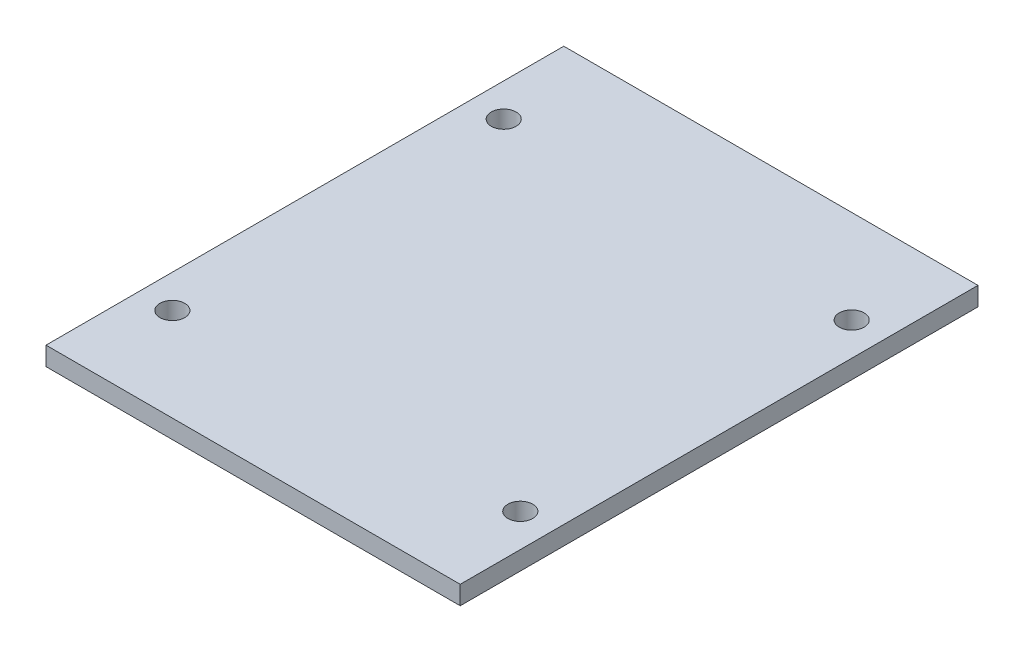
ISO-10303-21;
HEADER;
FILE_DESCRIPTION(('STEP AP214'),'2;1');
FILE_NAME('part.step','',(''),(''),'','','');
FILE_SCHEMA(('AUTOMOTIVE_DESIGN { 1 0 10303 214 1 1 1 1 }'));
ENDSEC;
DATA;
#1=APPLICATION_CONTEXT('core data for automotive mechanical design processes');
#2=APPLICATION_PROTOCOL_DEFINITION('international standard','automotive_design',2000,#1);
#3=PRODUCT_CONTEXT('',#1,'mechanical');
#4=PRODUCT('Part','Part','',(#3));
#5=PRODUCT_RELATED_PRODUCT_CATEGORY('part','',(#4));
#6=PRODUCT_DEFINITION_FORMATION('','',#4);
#7=PRODUCT_DEFINITION_CONTEXT('part definition',#1,'design');
#8=PRODUCT_DEFINITION('design','',#6,#7);
#9=PRODUCT_DEFINITION_SHAPE('','',#8);
#10=(LENGTH_UNIT() NAMED_UNIT(*) SI_UNIT(.MILLI.,.METRE.));
#11=(NAMED_UNIT(*) PLANE_ANGLE_UNIT() SI_UNIT($,.RADIAN.));
#12=(NAMED_UNIT(*) SI_UNIT($,.STERADIAN.) SOLID_ANGLE_UNIT());
#13=UNCERTAINTY_MEASURE_WITH_UNIT(LENGTH_MEASURE(1.E-05),#10,'distance_accuracy_value','');
#14=(GEOMETRIC_REPRESENTATION_CONTEXT(3) GLOBAL_UNCERTAINTY_ASSIGNED_CONTEXT((#13)) GLOBAL_UNIT_ASSIGNED_CONTEXT((#10,
#11,#12)) REPRESENTATION_CONTEXT('',''));
#15=CARTESIAN_POINT('',(0.,0.,0.));
#16=DIRECTION('',(0.,0.,1.));
#17=DIRECTION('',(1.,0.,0.));
#18=AXIS2_PLACEMENT_3D('',#15,#16,#17);
#19=CARTESIAN_POINT('',(0.,0.,250.));
#20=DIRECTION('',(1.,0.,0.));
#21=DIRECTION('',(0.,0.,-1.));
#22=AXIS2_PLACEMENT_3D('',#19,#20,#21);
#23=PLANE('',#22);
#24=DIRECTION('',(0.,-1.,0.));
#25=VECTOR('',#24,1.);
#26=CARTESIAN_POINT('',(0.,0.,0.));
#27=LINE('',#26,#25);
#28=CARTESIAN_POINT('',(0.,0.,0.));
#29=VERTEX_POINT('',#28);
#30=CARTESIAN_POINT('',(0.,-9.,0.));
#31=VERTEX_POINT('',#30);
#32=EDGE_CURVE('E107',#29,#31,#27,.T.);
#33=ORIENTED_EDGE('',*,*,#32,.T.);
#34=DIRECTION('',(0.,0.,-1.));
#35=VECTOR('',#34,1.);
#36=CARTESIAN_POINT('',(0.,-9.,250.));
#37=LINE('',#36,#35);
#38=CARTESIAN_POINT('',(0.,-9.,250.));
#39=VERTEX_POINT('',#38);
#40=EDGE_CURVE('E11',#39,#31,#37,.T.);
#41=ORIENTED_EDGE('',*,*,#40,.F.);
#42=DIRECTION('',(0.,-1.,0.));
#43=VECTOR('',#42,1.);
#44=CARTESIAN_POINT('',(0.,0.,250.));
#45=LINE('',#44,#43);
#46=CARTESIAN_POINT('',(0.,0.,250.));
#47=VERTEX_POINT('',#46);
#48=EDGE_CURVE('E89',#47,#39,#45,.T.);
#49=ORIENTED_EDGE('',*,*,#48,.F.);
#50=DIRECTION('',(0.,0.,-1.));
#51=VECTOR('',#50,1.);
#52=CARTESIAN_POINT('',(0.,0.,250.));
#53=LINE('',#52,#51);
#54=EDGE_CURVE('E56',#47,#29,#53,.T.);
#55=ORIENTED_EDGE('',*,*,#54,.T.);
#56=EDGE_LOOP('',(#33,#41,#49,#55));
#57=FACE_BOUND('',#56,.T.);
#58=ADVANCED_FACE('F39',(#57),#23,.F.);
#59=CARTESIAN_POINT('',(0.,-9.,250.));
#60=DIRECTION('',(0.,1.,0.));
#61=DIRECTION('',(0.,0.,1.));
#62=AXIS2_PLACEMENT_3D('',#59,#60,#61);
#63=PLANE('',#62);
#64=CARTESIAN_POINT('',(184.,-9.,45.));
#65=DIRECTION('',(0.,1.,0.));
#66=DIRECTION('',(0.,0.,1.));
#67=AXIS2_PLACEMENT_3D('',#64,#65,#66);
#68=CIRCLE('',#67,6.00000000000002);
#69=CARTESIAN_POINT('',(184.,-9.,51.));
#70=VERTEX_POINT('',#69);
#71=EDGE_CURVE('E130',#70,#70,#68,.T.);
#72=ORIENTED_EDGE('',*,*,#71,.T.);
#73=EDGE_LOOP('',(#72));
#74=FACE_BOUND('',#73,.T.);
#75=CARTESIAN_POINT('',(16.,-9.,205.));
#76=DIRECTION('',(0.,1.,0.));
#77=DIRECTION('',(0.,0.,1.));
#78=AXIS2_PLACEMENT_3D('',#75,#76,#77);
#79=CIRCLE('',#78,6.);
#80=CARTESIAN_POINT('',(16.,-9.,211.));
#81=VERTEX_POINT('',#80);
#82=EDGE_CURVE('E138',#81,#81,#79,.T.);
#83=ORIENTED_EDGE('',*,*,#82,.T.);
#84=EDGE_LOOP('',(#83));
#85=FACE_BOUND('',#84,.T.);
#86=CARTESIAN_POINT('',(184.,-9.,205.));
#87=DIRECTION('',(0.,1.,0.));
#88=DIRECTION('',(0.,0.,1.));
#89=AXIS2_PLACEMENT_3D('',#86,#87,#88);
#90=CIRCLE('',#89,6.00000000000002);
#91=CARTESIAN_POINT('',(184.,-9.,211.));
#92=VERTEX_POINT('',#91);
#93=EDGE_CURVE('E139',#92,#92,#90,.T.);
#94=ORIENTED_EDGE('',*,*,#93,.T.);
#95=EDGE_LOOP('',(#94));
#96=FACE_BOUND('',#95,.T.);
#97=CARTESIAN_POINT('',(16.,-9.,45.));
#98=DIRECTION('',(0.,1.,0.));
#99=DIRECTION('',(0.,0.,1.));
#100=AXIS2_PLACEMENT_3D('',#97,#98,#99);
#101=CIRCLE('',#100,6.);
#102=CARTESIAN_POINT('',(16.,-9.,51.));
#103=VERTEX_POINT('',#102);
#104=EDGE_CURVE('E110',#103,#103,#101,.T.);
#105=ORIENTED_EDGE('',*,*,#104,.T.);
#106=EDGE_LOOP('',(#105));
#107=FACE_BOUND('',#106,.T.);
#108=DIRECTION('',(1.,0.,0.));
#109=VECTOR('',#108,1.);
#110=CARTESIAN_POINT('',(0.,-9.,0.));
#111=LINE('',#110,#109);
#112=CARTESIAN_POINT('',(200.,-9.,0.));
#113=VERTEX_POINT('',#112);
#114=EDGE_CURVE('E95',#31,#113,#111,.T.);
#115=ORIENTED_EDGE('',*,*,#114,.T.);
#116=DIRECTION('',(0.,0.,-1.));
#117=VECTOR('',#116,1.);
#118=CARTESIAN_POINT('',(200.,-9.,250.));
#119=LINE('',#118,#117);
#120=CARTESIAN_POINT('',(200.,-9.,250.));
#121=VERTEX_POINT('',#120);
#122=EDGE_CURVE('E48',#121,#113,#119,.T.);
#123=ORIENTED_EDGE('',*,*,#122,.F.);
#124=DIRECTION('',(1.,0.,0.));
#125=VECTOR('',#124,1.);
#126=CARTESIAN_POINT('',(0.,-9.,250.));
#127=LINE('',#126,#125);
#128=EDGE_CURVE('E81',#39,#121,#127,.T.);
#129=ORIENTED_EDGE('',*,*,#128,.F.);
#130=ORIENTED_EDGE('',*,*,#40,.T.);
#131=EDGE_LOOP('',(#115,#123,#129,#130));
#132=FACE_BOUND('',#131,.T.);
#133=ADVANCED_FACE('F94',(#74,#85,#96,#107,#132),#63,.F.);
#134=CARTESIAN_POINT('',(200.,0.,250.));
#135=DIRECTION('',(1.,0.,0.));
#136=DIRECTION('',(0.,0.,-1.));
#137=AXIS2_PLACEMENT_3D('',#134,#135,#136);
#138=PLANE('',#137);
#139=DIRECTION('',(0.,-1.,0.));
#140=VECTOR('',#139,1.);
#141=CARTESIAN_POINT('',(200.,0.,0.));
#142=LINE('',#141,#140);
#143=CARTESIAN_POINT('',(200.,0.,0.));
#144=VERTEX_POINT('',#143);
#145=EDGE_CURVE('E113',#144,#113,#142,.T.);
#146=ORIENTED_EDGE('',*,*,#145,.F.);
#147=DIRECTION('',(0.,0.,-1.));
#148=VECTOR('',#147,1.);
#149=CARTESIAN_POINT('',(200.,0.,250.));
#150=LINE('',#149,#148);
#151=CARTESIAN_POINT('',(200.,0.,250.));
#152=VERTEX_POINT('',#151);
#153=EDGE_CURVE('E70',#152,#144,#150,.T.);
#154=ORIENTED_EDGE('',*,*,#153,.F.);
#155=DIRECTION('',(0.,-1.,0.));
#156=VECTOR('',#155,1.);
#157=CARTESIAN_POINT('',(200.,0.,250.));
#158=LINE('',#157,#156);
#159=EDGE_CURVE('E88',#152,#121,#158,.T.);
#160=ORIENTED_EDGE('',*,*,#159,.T.);
#161=ORIENTED_EDGE('',*,*,#122,.T.);
#162=EDGE_LOOP('',(#146,#154,#160,#161));
#163=FACE_BOUND('',#162,.T.);
#164=ADVANCED_FACE('F99',(#163),#138,.T.);
#165=CARTESIAN_POINT('',(0.,0.,250.));
#166=DIRECTION('',(0.,1.,0.));
#167=DIRECTION('',(0.,0.,1.));
#168=AXIS2_PLACEMENT_3D('',#165,#166,#167);
#169=PLANE('',#168);
#170=CARTESIAN_POINT('',(184.,0.,45.));
#171=DIRECTION('',(0.,1.,0.));
#172=DIRECTION('',(0.,0.,1.));
#173=AXIS2_PLACEMENT_3D('',#170,#171,#172);
#174=CIRCLE('',#173,6.00000000000002);
#175=CARTESIAN_POINT('',(184.,0.,51.));
#176=VERTEX_POINT('',#175);
#177=EDGE_CURVE('E143',#176,#176,#174,.T.);
#178=ORIENTED_EDGE('',*,*,#177,.F.);
#179=EDGE_LOOP('',(#178));
#180=FACE_BOUND('',#179,.T.);
#181=CARTESIAN_POINT('',(16.,0.,205.));
#182=DIRECTION('',(0.,1.,0.));
#183=DIRECTION('',(0.,0.,1.));
#184=AXIS2_PLACEMENT_3D('',#181,#182,#183);
#185=CIRCLE('',#184,6.);
#186=CARTESIAN_POINT('',(16.,0.,211.));
#187=VERTEX_POINT('',#186);
#188=EDGE_CURVE('E134',#187,#187,#185,.T.);
#189=ORIENTED_EDGE('',*,*,#188,.F.);
#190=EDGE_LOOP('',(#189));
#191=FACE_BOUND('',#190,.T.);
#192=CARTESIAN_POINT('',(184.,0.,205.));
#193=DIRECTION('',(0.,1.,0.));
#194=DIRECTION('',(0.,0.,1.));
#195=AXIS2_PLACEMENT_3D('',#192,#193,#194);
#196=CIRCLE('',#195,6.00000000000002);
#197=CARTESIAN_POINT('',(184.,0.,211.));
#198=VERTEX_POINT('',#197);
#199=EDGE_CURVE('E150',#198,#198,#196,.T.);
#200=ORIENTED_EDGE('',*,*,#199,.F.);
#201=EDGE_LOOP('',(#200));
#202=FACE_BOUND('',#201,.T.);
#203=CARTESIAN_POINT('',(16.,0.,45.));
#204=DIRECTION('',(0.,1.,0.));
#205=DIRECTION('',(0.,0.,1.));
#206=AXIS2_PLACEMENT_3D('',#203,#204,#205);
#207=CIRCLE('',#206,6.);
#208=CARTESIAN_POINT('',(16.,0.,51.));
#209=VERTEX_POINT('',#208);
#210=EDGE_CURVE('E126',#209,#209,#207,.T.);
#211=ORIENTED_EDGE('',*,*,#210,.F.);
#212=EDGE_LOOP('',(#211));
#213=FACE_BOUND('',#212,.T.);
#214=DIRECTION('',(1.,0.,0.));
#215=VECTOR('',#214,1.);
#216=CARTESIAN_POINT('',(0.,0.,0.));
#217=LINE('',#216,#215);
#218=EDGE_CURVE('E116',#29,#144,#217,.T.);
#219=ORIENTED_EDGE('',*,*,#218,.F.);
#220=ORIENTED_EDGE('',*,*,#54,.F.);
#221=DIRECTION('',(1.,0.,0.));
#222=VECTOR('',#221,1.);
#223=CARTESIAN_POINT('',(0.,0.,250.));
#224=LINE('',#223,#222);
#225=EDGE_CURVE('E101',#47,#152,#224,.T.);
#226=ORIENTED_EDGE('',*,*,#225,.T.);
#227=ORIENTED_EDGE('',*,*,#153,.T.);
#228=EDGE_LOOP('',(#219,#220,#226,#227));
#229=FACE_BOUND('',#228,.T.);
#230=ADVANCED_FACE('F168',(#180,#191,#202,#213,#229),#169,.T.);
#231=CARTESIAN_POINT('',(0.,0.,250.));
#232=DIRECTION('',(0.,0.,1.));
#233=DIRECTION('',(1.,0.,0.));
#234=AXIS2_PLACEMENT_3D('',#231,#232,#233);
#235=PLANE('',#234);
#236=ORIENTED_EDGE('',*,*,#48,.T.);
#237=ORIENTED_EDGE('',*,*,#128,.T.);
#238=ORIENTED_EDGE('',*,*,#159,.F.);
#239=ORIENTED_EDGE('',*,*,#225,.F.);
#240=EDGE_LOOP('',(#236,#237,#238,#239));
#241=FACE_BOUND('',#240,.T.);
#242=ADVANCED_FACE('F85',(#241),#235,.T.);
#243=CARTESIAN_POINT('',(0.,0.,0.));
#244=DIRECTION('',(0.,0.,1.));
#245=DIRECTION('',(1.,0.,0.));
#246=AXIS2_PLACEMENT_3D('',#243,#244,#245);
#247=PLANE('',#246);
#248=ORIENTED_EDGE('',*,*,#32,.F.);
#249=ORIENTED_EDGE('',*,*,#218,.T.);
#250=ORIENTED_EDGE('',*,*,#145,.T.);
#251=ORIENTED_EDGE('',*,*,#114,.F.);
#252=EDGE_LOOP('',(#248,#249,#250,#251));
#253=FACE_BOUND('',#252,.T.);
#254=ADVANCED_FACE('F176',(#253),#247,.F.);
#255=CARTESIAN_POINT('',(16.,-9.,45.));
#256=DIRECTION('',(0.,1.,0.));
#257=DIRECTION('',(0.,0.,1.));
#258=AXIS2_PLACEMENT_3D('',#255,#256,#257);
#259=CYLINDRICAL_SURFACE('',#258,6.);
#260=ORIENTED_EDGE('',*,*,#104,.F.);
#261=EDGE_LOOP('',(#260));
#262=FACE_BOUND('',#261,.T.);
#263=ORIENTED_EDGE('',*,*,#210,.T.);
#264=EDGE_LOOP('',(#263));
#265=FACE_BOUND('',#264,.T.);
#266=ADVANCED_FACE('F164',(#262,#265),#259,.F.);
#267=CARTESIAN_POINT('',(184.,-9.,205.));
#268=DIRECTION('',(0.,1.,0.));
#269=DIRECTION('',(0.,0.,1.));
#270=AXIS2_PLACEMENT_3D('',#267,#268,#269);
#271=CYLINDRICAL_SURFACE('',#270,6.00000000000002);
#272=ORIENTED_EDGE('',*,*,#93,.F.);
#273=EDGE_LOOP('',(#272));
#274=FACE_BOUND('',#273,.T.);
#275=ORIENTED_EDGE('',*,*,#199,.T.);
#276=EDGE_LOOP('',(#275));
#277=FACE_BOUND('',#276,.T.);
#278=ADVANCED_FACE('F160',(#274,#277),#271,.F.);
#279=CARTESIAN_POINT('',(16.,-9.,205.));
#280=DIRECTION('',(0.,1.,0.));
#281=DIRECTION('',(0.,0.,1.));
#282=AXIS2_PLACEMENT_3D('',#279,#280,#281);
#283=CYLINDRICAL_SURFACE('',#282,6.);
#284=ORIENTED_EDGE('',*,*,#82,.F.);
#285=EDGE_LOOP('',(#284));
#286=FACE_BOUND('',#285,.T.);
#287=ORIENTED_EDGE('',*,*,#188,.T.);
#288=EDGE_LOOP('',(#287));
#289=FACE_BOUND('',#288,.T.);
#290=ADVANCED_FACE('F163',(#286,#289),#283,.F.);
#291=CARTESIAN_POINT('',(184.,-9.,45.));
#292=DIRECTION('',(0.,1.,0.));
#293=DIRECTION('',(0.,0.,1.));
#294=AXIS2_PLACEMENT_3D('',#291,#292,#293);
#295=CYLINDRICAL_SURFACE('',#294,6.00000000000002);
#296=ORIENTED_EDGE('',*,*,#71,.F.);
#297=EDGE_LOOP('',(#296));
#298=FACE_BOUND('',#297,.T.);
#299=ORIENTED_EDGE('',*,*,#177,.T.);
#300=EDGE_LOOP('',(#299));
#301=FACE_BOUND('',#300,.T.);
#302=ADVANCED_FACE('F235',(#298,#301),#295,.F.);
#303=CLOSED_SHELL('',(#58,#133,#164,#230,#242,#254,#266,#278,#290,#302));
#304=MANIFOLD_SOLID_BREP('B2',#303);
#305=ADVANCED_BREP_SHAPE_REPRESENTATION('',(#18,#304),#14);
#306=SHAPE_DEFINITION_REPRESENTATION(#9,#305);
ENDSEC;
END-ISO-10303-21;
